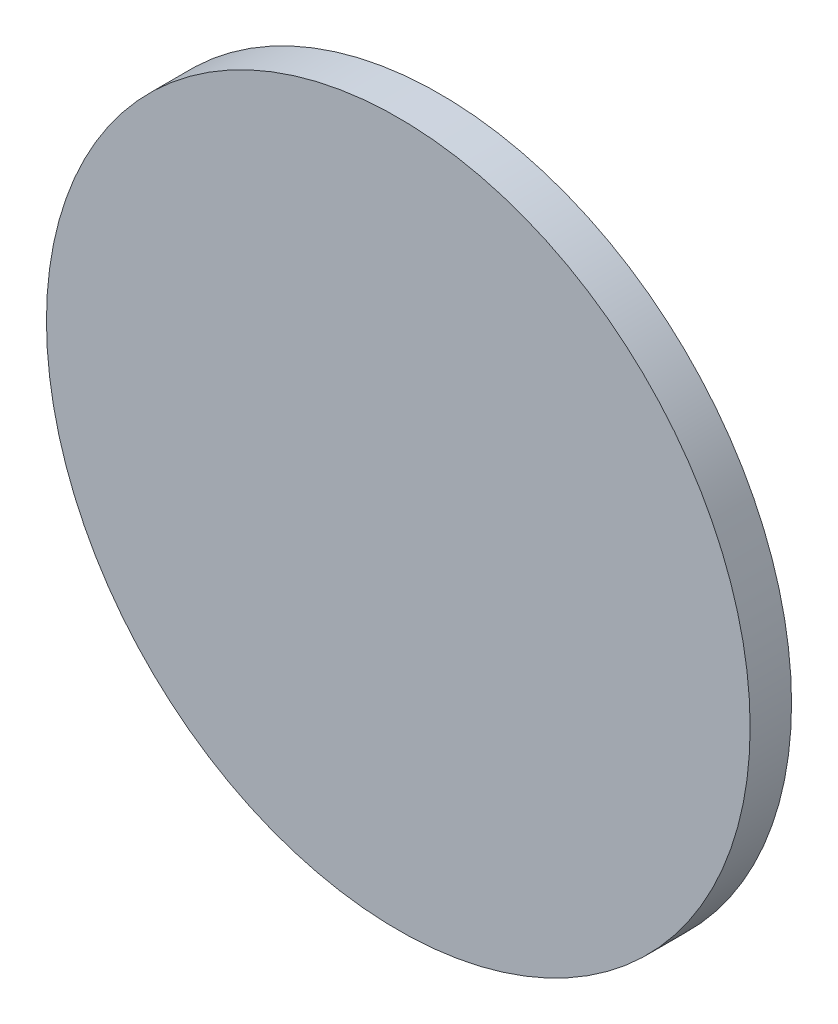
ISO-10303-21;
HEADER;
FILE_DESCRIPTION(('STEP AP214'),'2;1');
FILE_NAME('part.step','',(''),(''),'','','');
FILE_SCHEMA(('AUTOMOTIVE_DESIGN { 1 0 10303 214 1 1 1 1 }'));
ENDSEC;
DATA;
#1=APPLICATION_CONTEXT('core data for automotive mechanical design processes');
#2=APPLICATION_PROTOCOL_DEFINITION('international standard','automotive_design',2000,#1);
#3=PRODUCT_CONTEXT('',#1,'mechanical');
#4=PRODUCT('Part','Part','',(#3));
#5=PRODUCT_RELATED_PRODUCT_CATEGORY('part','',(#4));
#6=PRODUCT_DEFINITION_FORMATION('','',#4);
#7=PRODUCT_DEFINITION_CONTEXT('part definition',#1,'design');
#8=PRODUCT_DEFINITION('design','',#6,#7);
#9=PRODUCT_DEFINITION_SHAPE('','',#8);
#10=(LENGTH_UNIT() NAMED_UNIT(*) SI_UNIT(.MILLI.,.METRE.));
#11=(NAMED_UNIT(*) PLANE_ANGLE_UNIT() SI_UNIT($,.RADIAN.));
#12=(NAMED_UNIT(*) SI_UNIT($,.STERADIAN.) SOLID_ANGLE_UNIT());
#13=UNCERTAINTY_MEASURE_WITH_UNIT(LENGTH_MEASURE(1.E-05),#10,'distance_accuracy_value','');
#14=(GEOMETRIC_REPRESENTATION_CONTEXT(3) GLOBAL_UNCERTAINTY_ASSIGNED_CONTEXT((#13)) GLOBAL_UNIT_ASSIGNED_CONTEXT((#10,
#11,#12)) REPRESENTATION_CONTEXT('',''));
#15=CARTESIAN_POINT('',(0.,0.,0.));
#16=DIRECTION('',(0.,0.,1.));
#17=DIRECTION('',(1.,0.,0.));
#18=AXIS2_PLACEMENT_3D('',#15,#16,#17);
#19=CARTESIAN_POINT('',(0.,0.,5.));
#20=DIRECTION('',(0.,0.,-1.));
#21=DIRECTION('',(-1.,0.,0.));
#22=AXIS2_PLACEMENT_3D('',#19,#20,#21);
#23=CYLINDRICAL_SURFACE('',#22,42.5);
#24=CARTESIAN_POINT('',(0.,0.,5.));
#25=DIRECTION('',(0.,0.,1.));
#26=DIRECTION('',(1.,0.,0.));
#27=AXIS2_PLACEMENT_3D('',#24,#25,#26);
#28=CIRCLE('',#27,42.5);
#29=CARTESIAN_POINT('',(42.5,0.,5.));
#30=VERTEX_POINT('',#29);
#31=EDGE_CURVE('E10',#30,#30,#28,.T.);
#32=ORIENTED_EDGE('',*,*,#31,.F.);
#33=EDGE_LOOP('',(#32));
#34=FACE_BOUND('',#33,.T.);
#35=CARTESIAN_POINT('',(0.,0.,0.));
#36=DIRECTION('',(0.,0.,1.));
#37=DIRECTION('',(1.,0.,0.));
#38=AXIS2_PLACEMENT_3D('',#35,#36,#37);
#39=CIRCLE('',#38,42.5);
#40=CARTESIAN_POINT('',(42.5,0.,0.));
#41=VERTEX_POINT('',#40);
#42=EDGE_CURVE('E33',#41,#41,#39,.T.);
#43=ORIENTED_EDGE('',*,*,#42,.T.);
#44=EDGE_LOOP('',(#43));
#45=FACE_BOUND('',#44,.T.);
#46=ADVANCED_FACE('F30',(#34,#45),#23,.T.);
#47=CARTESIAN_POINT('',(0.,0.,5.));
#48=DIRECTION('',(0.,0.,1.));
#49=DIRECTION('',(1.,0.,0.));
#50=AXIS2_PLACEMENT_3D('',#47,#48,#49);
#51=PLANE('',#50);
#52=ORIENTED_EDGE('',*,*,#31,.T.);
#53=EDGE_LOOP('',(#52));
#54=FACE_BOUND('',#53,.T.);
#55=ADVANCED_FACE('F45',(#54),#51,.T.);
#56=CARTESIAN_POINT('',(0.,0.,0.));
#57=DIRECTION('',(0.,0.,1.));
#58=DIRECTION('',(1.,0.,0.));
#59=AXIS2_PLACEMENT_3D('',#56,#57,#58);
#60=PLANE('',#59);
#61=ORIENTED_EDGE('',*,*,#42,.F.);
#62=EDGE_LOOP('',(#61));
#63=FACE_BOUND('',#62,.T.);
#64=ADVANCED_FACE('F43',(#63),#60,.F.);
#65=CLOSED_SHELL('',(#46,#55,#64));
#66=MANIFOLD_SOLID_BREP('B2',#65);
#67=ADVANCED_BREP_SHAPE_REPRESENTATION('',(#18,#66),#14);
#68=SHAPE_DEFINITION_REPRESENTATION(#9,#67);
ENDSEC;
END-ISO-10303-21;
